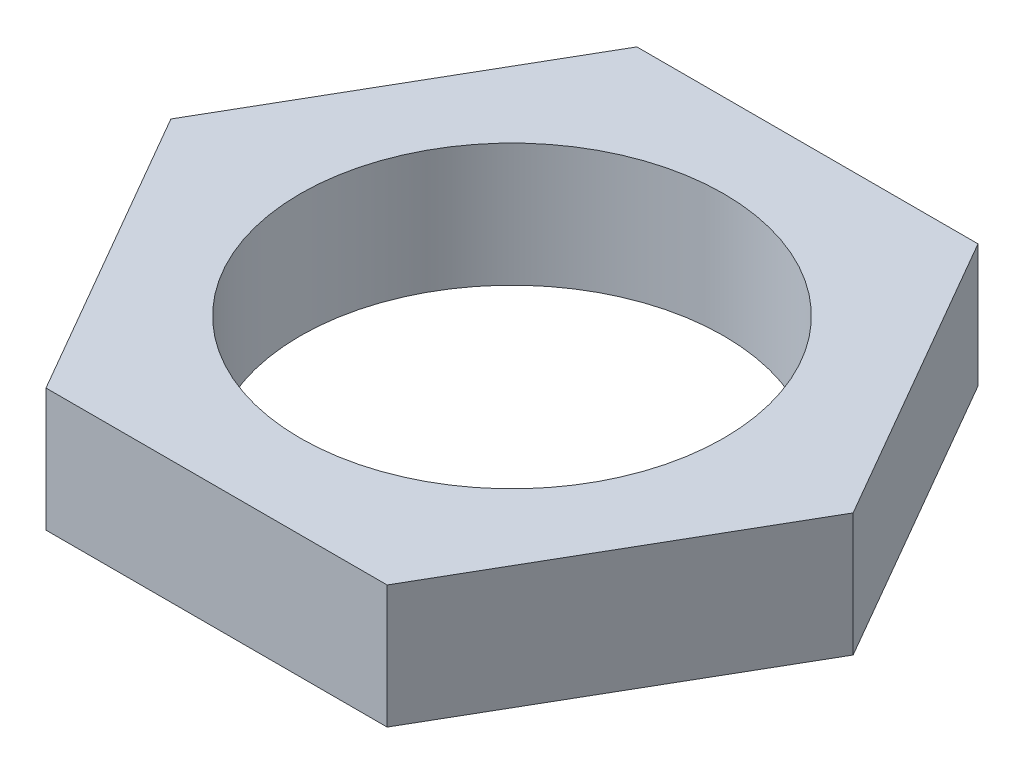
ISO-10303-21;
HEADER;
FILE_DESCRIPTION(('STEP AP214'),'2;1');
FILE_NAME('part.step','',(''),(''),'','','');
FILE_SCHEMA(('AUTOMOTIVE_DESIGN { 1 0 10303 214 1 1 1 1 }'));
ENDSEC;
DATA;
#1=APPLICATION_CONTEXT('core data for automotive mechanical design processes');
#2=APPLICATION_PROTOCOL_DEFINITION('international standard','automotive_design',2000,#1);
#3=PRODUCT_CONTEXT('',#1,'mechanical');
#4=PRODUCT('Part','Part','',(#3));
#5=PRODUCT_RELATED_PRODUCT_CATEGORY('part','',(#4));
#6=PRODUCT_DEFINITION_FORMATION('','',#4);
#7=PRODUCT_DEFINITION_CONTEXT('part definition',#1,'design');
#8=PRODUCT_DEFINITION('design','',#6,#7);
#9=PRODUCT_DEFINITION_SHAPE('','',#8);
#10=(LENGTH_UNIT() NAMED_UNIT(*) SI_UNIT(.MILLI.,.METRE.));
#11=(NAMED_UNIT(*) PLANE_ANGLE_UNIT() SI_UNIT($,.RADIAN.));
#12=(NAMED_UNIT(*) SI_UNIT($,.STERADIAN.) SOLID_ANGLE_UNIT());
#13=UNCERTAINTY_MEASURE_WITH_UNIT(LENGTH_MEASURE(1.E-05),#10,'distance_accuracy_value','');
#14=(GEOMETRIC_REPRESENTATION_CONTEXT(3) GLOBAL_UNCERTAINTY_ASSIGNED_CONTEXT((#13)) GLOBAL_UNIT_ASSIGNED_CONTEXT((#10,
#11,#12)) REPRESENTATION_CONTEXT('',''));
#15=CARTESIAN_POINT('',(0.,0.,0.));
#16=DIRECTION('',(0.,0.,1.));
#17=DIRECTION('',(1.,0.,0.));
#18=AXIS2_PLACEMENT_3D('',#15,#16,#17);
#19=CARTESIAN_POINT('',(6.92820323027551,5.,12.));
#20=DIRECTION('',(0.,1.,0.));
#21=DIRECTION('',(0.,0.,1.));
#22=AXIS2_PLACEMENT_3D('',#19,#20,#21);
#23=PLANE('',#22);
#24=DIRECTION('',(1.,0.,0.));
#25=VECTOR('',#24,1.);
#26=CARTESIAN_POINT('',(-6.92820323027551,5.,12.));
#27=LINE('',#26,#25);
#28=CARTESIAN_POINT('',(-6.92820323027551,5.,12.));
#29=VERTEX_POINT('',#28);
#30=CARTESIAN_POINT('',(6.92820323027551,5.,12.));
#31=VERTEX_POINT('',#30);
#32=EDGE_CURVE('E127',#29,#31,#27,.T.);
#33=ORIENTED_EDGE('',*,*,#32,.T.);
#34=DIRECTION('',(0.5,0.,-0.866025403784439));
#35=VECTOR('',#34,1.);
#36=CARTESIAN_POINT('',(6.92820323027551,5.,12.));
#37=LINE('',#36,#35);
#38=CARTESIAN_POINT('',(13.856406460551,5.,0.));
#39=VERTEX_POINT('',#38);
#40=EDGE_CURVE('E85',#31,#39,#37,.T.);
#41=ORIENTED_EDGE('',*,*,#40,.T.);
#42=DIRECTION('',(-0.5,0.,-0.866025403784439));
#43=VECTOR('',#42,1.);
#44=CARTESIAN_POINT('',(13.856406460551,5.,0.));
#45=LINE('',#44,#43);
#46=CARTESIAN_POINT('',(6.92820323027551,5.,-12.));
#47=VERTEX_POINT('',#46);
#48=EDGE_CURVE('E98',#39,#47,#45,.T.);
#49=ORIENTED_EDGE('',*,*,#48,.T.);
#50=DIRECTION('',(-1.,0.,0.));
#51=VECTOR('',#50,1.);
#52=CARTESIAN_POINT('',(6.92820323027551,5.,-12.));
#53=LINE('',#52,#51);
#54=CARTESIAN_POINT('',(-6.92820323027551,5.,-12.));
#55=VERTEX_POINT('',#54);
#56=EDGE_CURVE('E92',#47,#55,#53,.T.);
#57=ORIENTED_EDGE('',*,*,#56,.T.);
#58=DIRECTION('',(-0.5,0.,0.866025403784438));
#59=VECTOR('',#58,1.);
#60=CARTESIAN_POINT('',(-6.92820323027551,5.,-12.));
#61=LINE('',#60,#59);
#62=CARTESIAN_POINT('',(-13.856406460551,5.,0.));
#63=VERTEX_POINT('',#62);
#64=EDGE_CURVE('E96',#55,#63,#61,.T.);
#65=ORIENTED_EDGE('',*,*,#64,.T.);
#66=DIRECTION('',(0.5,0.,0.866025403784439));
#67=VECTOR('',#66,1.);
#68=CARTESIAN_POINT('',(-13.856406460551,5.,0.));
#69=LINE('',#68,#67);
#70=EDGE_CURVE('E48',#63,#29,#69,.T.);
#71=ORIENTED_EDGE('',*,*,#70,.T.);
#72=EDGE_LOOP('',(#33,#41,#49,#57,#65,#71));
#73=FACE_BOUND('',#72,.T.);
#74=CARTESIAN_POINT('',(0.,5.,0.));
#75=DIRECTION('',(0.,1.,0.));
#76=DIRECTION('',(0.,0.,1.));
#77=AXIS2_PLACEMENT_3D('',#74,#75,#76);
#78=CIRCLE('',#77,8.6);
#79=CARTESIAN_POINT('',(0.,5.,8.6));
#80=VERTEX_POINT('',#79);
#81=EDGE_CURVE('E120',#80,#80,#78,.T.);
#82=ORIENTED_EDGE('',*,*,#81,.F.);
#83=EDGE_LOOP('',(#82));
#84=FACE_BOUND('',#83,.T.);
#85=ADVANCED_FACE('F31',(#73,#84),#23,.T.);
#86=CARTESIAN_POINT('',(6.92820323027551,0.,12.));
#87=DIRECTION('',(0.,1.,0.));
#88=DIRECTION('',(0.,0.,1.));
#89=AXIS2_PLACEMENT_3D('',#86,#87,#88);
#90=PLANE('',#89);
#91=DIRECTION('',(1.,0.,0.));
#92=VECTOR('',#91,1.);
#93=CARTESIAN_POINT('',(-6.92820323027551,0.,12.));
#94=LINE('',#93,#92);
#95=CARTESIAN_POINT('',(-6.92820323027551,0.,12.));
#96=VERTEX_POINT('',#95);
#97=CARTESIAN_POINT('',(6.92820323027551,0.,12.));
#98=VERTEX_POINT('',#97);
#99=EDGE_CURVE('E116',#96,#98,#94,.T.);
#100=ORIENTED_EDGE('',*,*,#99,.F.);
#101=DIRECTION('',(0.5,0.,0.866025403784439));
#102=VECTOR('',#101,1.);
#103=CARTESIAN_POINT('',(-13.856406460551,0.,0.));
#104=LINE('',#103,#102);
#105=CARTESIAN_POINT('',(-13.856406460551,0.,0.));
#106=VERTEX_POINT('',#105);
#107=EDGE_CURVE('E77',#106,#96,#104,.T.);
#108=ORIENTED_EDGE('',*,*,#107,.F.);
#109=DIRECTION('',(-0.5,0.,0.866025403784438));
#110=VECTOR('',#109,1.);
#111=CARTESIAN_POINT('',(-6.92820323027551,0.,-12.));
#112=LINE('',#111,#110);
#113=CARTESIAN_POINT('',(-6.92820323027551,0.,-12.));
#114=VERTEX_POINT('',#113);
#115=EDGE_CURVE('E71',#114,#106,#112,.T.);
#116=ORIENTED_EDGE('',*,*,#115,.F.);
#117=DIRECTION('',(-1.,0.,0.));
#118=VECTOR('',#117,1.);
#119=CARTESIAN_POINT('',(6.92820323027551,0.,-12.));
#120=LINE('',#119,#118);
#121=CARTESIAN_POINT('',(6.92820323027551,0.,-12.));
#122=VERTEX_POINT('',#121);
#123=EDGE_CURVE('E106',#122,#114,#120,.T.);
#124=ORIENTED_EDGE('',*,*,#123,.F.);
#125=DIRECTION('',(-0.5,0.,-0.866025403784439));
#126=VECTOR('',#125,1.);
#127=CARTESIAN_POINT('',(13.856406460551,0.,0.));
#128=LINE('',#127,#126);
#129=CARTESIAN_POINT('',(13.856406460551,0.,0.));
#130=VERTEX_POINT('',#129);
#131=EDGE_CURVE('E122',#130,#122,#128,.T.);
#132=ORIENTED_EDGE('',*,*,#131,.F.);
#133=DIRECTION('',(0.5,0.,-0.866025403784439));
#134=VECTOR('',#133,1.);
#135=CARTESIAN_POINT('',(6.92820323027551,0.,12.));
#136=LINE('',#135,#134);
#137=EDGE_CURVE('E119',#98,#130,#136,.T.);
#138=ORIENTED_EDGE('',*,*,#137,.F.);
#139=EDGE_LOOP('',(#100,#108,#116,#124,#132,#138));
#140=FACE_BOUND('',#139,.T.);
#141=CARTESIAN_POINT('',(0.,0.,0.));
#142=DIRECTION('',(0.,1.,0.));
#143=DIRECTION('',(0.,0.,1.));
#144=AXIS2_PLACEMENT_3D('',#141,#142,#143);
#145=CIRCLE('',#144,8.6);
#146=CARTESIAN_POINT('',(0.,0.,8.6));
#147=VERTEX_POINT('',#146);
#148=EDGE_CURVE('E220',#147,#147,#145,.T.);
#149=ORIENTED_EDGE('',*,*,#148,.T.);
#150=EDGE_LOOP('',(#149));
#151=FACE_BOUND('',#150,.T.);
#152=ADVANCED_FACE('F136',(#140,#151),#90,.F.);
#153=CARTESIAN_POINT('',(-6.92820323027551,5.,12.));
#154=DIRECTION('',(0.,0.,-1.));
#155=DIRECTION('',(-1.,0.,0.));
#156=AXIS2_PLACEMENT_3D('',#153,#154,#155);
#157=PLANE('',#156);
#158=ORIENTED_EDGE('',*,*,#99,.T.);
#159=DIRECTION('',(0.,-1.,0.));
#160=VECTOR('',#159,1.);
#161=CARTESIAN_POINT('',(6.92820323027551,5.,12.));
#162=LINE('',#161,#160);
#163=EDGE_CURVE('E11',#31,#98,#162,.T.);
#164=ORIENTED_EDGE('',*,*,#163,.F.);
#165=ORIENTED_EDGE('',*,*,#32,.F.);
#166=DIRECTION('',(0.,-1.,0.));
#167=VECTOR('',#166,1.);
#168=CARTESIAN_POINT('',(-6.92820323027551,5.,12.));
#169=LINE('',#168,#167);
#170=EDGE_CURVE('E112',#29,#96,#169,.T.);
#171=ORIENTED_EDGE('',*,*,#170,.T.);
#172=EDGE_LOOP('',(#158,#164,#165,#171));
#173=FACE_BOUND('',#172,.T.);
#174=ADVANCED_FACE('F33',(#173),#157,.F.);
#175=CARTESIAN_POINT('',(6.92820323027551,5.,12.));
#176=DIRECTION('',(-0.866025403784439,0.,-0.5));
#177=DIRECTION('',(-0.5,0.,0.866025403784439));
#178=AXIS2_PLACEMENT_3D('',#175,#176,#177);
#179=PLANE('',#178);
#180=ORIENTED_EDGE('',*,*,#137,.T.);
#181=DIRECTION('',(0.,-1.,0.));
#182=VECTOR('',#181,1.);
#183=CARTESIAN_POINT('',(13.856406460551,5.,0.));
#184=LINE('',#183,#182);
#185=EDGE_CURVE('E40',#39,#130,#184,.T.);
#186=ORIENTED_EDGE('',*,*,#185,.F.);
#187=ORIENTED_EDGE('',*,*,#40,.F.);
#188=ORIENTED_EDGE('',*,*,#163,.T.);
#189=EDGE_LOOP('',(#180,#186,#187,#188));
#190=FACE_BOUND('',#189,.T.);
#191=ADVANCED_FACE('F161',(#190),#179,.F.);
#192=CARTESIAN_POINT('',(13.856406460551,5.,0.));
#193=DIRECTION('',(-0.866025403784439,0.,0.5));
#194=DIRECTION('',(0.5,0.,0.866025403784439));
#195=AXIS2_PLACEMENT_3D('',#192,#193,#194);
#196=PLANE('',#195);
#197=ORIENTED_EDGE('',*,*,#131,.T.);
#198=DIRECTION('',(0.,-1.,0.));
#199=VECTOR('',#198,1.);
#200=CARTESIAN_POINT('',(6.92820323027551,5.,-12.));
#201=LINE('',#200,#199);
#202=EDGE_CURVE('E107',#47,#122,#201,.T.);
#203=ORIENTED_EDGE('',*,*,#202,.F.);
#204=ORIENTED_EDGE('',*,*,#48,.F.);
#205=ORIENTED_EDGE('',*,*,#185,.T.);
#206=EDGE_LOOP('',(#197,#203,#204,#205));
#207=FACE_BOUND('',#206,.T.);
#208=ADVANCED_FACE('F133',(#207),#196,.F.);
#209=CARTESIAN_POINT('',(6.92820323027551,5.,-12.));
#210=DIRECTION('',(0.,0.,1.));
#211=DIRECTION('',(1.,0.,0.));
#212=AXIS2_PLACEMENT_3D('',#209,#210,#211);
#213=PLANE('',#212);
#214=ORIENTED_EDGE('',*,*,#123,.T.);
#215=DIRECTION('',(0.,-1.,0.));
#216=VECTOR('',#215,1.);
#217=CARTESIAN_POINT('',(-6.92820323027551,5.,-12.));
#218=LINE('',#217,#216);
#219=EDGE_CURVE('E103',#55,#114,#218,.T.);
#220=ORIENTED_EDGE('',*,*,#219,.F.);
#221=ORIENTED_EDGE('',*,*,#56,.F.);
#222=ORIENTED_EDGE('',*,*,#202,.T.);
#223=EDGE_LOOP('',(#214,#220,#221,#222));
#224=FACE_BOUND('',#223,.T.);
#225=ADVANCED_FACE('F104',(#224),#213,.F.);
#226=CARTESIAN_POINT('',(-6.92820323027551,5.,-12.));
#227=DIRECTION('',(0.866025403784438,0.,0.5));
#228=DIRECTION('',(0.5,0.,-0.866025403784439));
#229=AXIS2_PLACEMENT_3D('',#226,#227,#228);
#230=PLANE('',#229);
#231=ORIENTED_EDGE('',*,*,#115,.T.);
#232=DIRECTION('',(0.,-1.,0.));
#233=VECTOR('',#232,1.);
#234=CARTESIAN_POINT('',(-13.856406460551,5.,0.));
#235=LINE('',#234,#233);
#236=EDGE_CURVE('E108',#63,#106,#235,.T.);
#237=ORIENTED_EDGE('',*,*,#236,.F.);
#238=ORIENTED_EDGE('',*,*,#64,.F.);
#239=ORIENTED_EDGE('',*,*,#219,.T.);
#240=EDGE_LOOP('',(#231,#237,#238,#239));
#241=FACE_BOUND('',#240,.T.);
#242=ADVANCED_FACE('F110',(#241),#230,.F.);
#243=CARTESIAN_POINT('',(-13.856406460551,5.,0.));
#244=DIRECTION('',(0.866025403784439,0.,-0.5));
#245=DIRECTION('',(-0.5,0.,-0.866025403784439));
#246=AXIS2_PLACEMENT_3D('',#243,#244,#245);
#247=PLANE('',#246);
#248=ORIENTED_EDGE('',*,*,#107,.T.);
#249=ORIENTED_EDGE('',*,*,#170,.F.);
#250=ORIENTED_EDGE('',*,*,#70,.F.);
#251=ORIENTED_EDGE('',*,*,#236,.T.);
#252=EDGE_LOOP('',(#248,#249,#250,#251));
#253=FACE_BOUND('',#252,.T.);
#254=ADVANCED_FACE('F141',(#253),#247,.F.);
#255=CARTESIAN_POINT('',(0.,5.,0.));
#256=DIRECTION('',(0.,-1.,0.));
#257=DIRECTION('',(0.,0.,-1.));
#258=AXIS2_PLACEMENT_3D('',#255,#256,#257);
#259=CYLINDRICAL_SURFACE('',#258,8.6);
#260=ORIENTED_EDGE('',*,*,#81,.T.);
#261=EDGE_LOOP('',(#260));
#262=FACE_BOUND('',#261,.T.);
#263=ORIENTED_EDGE('',*,*,#148,.F.);
#264=EDGE_LOOP('',(#263));
#265=FACE_BOUND('',#264,.T.);
#266=ADVANCED_FACE('F143',(#262,#265),#259,.F.);
#267=CLOSED_SHELL('',(#85,#152,#174,#191,#208,#225,#242,#254,#266));
#268=MANIFOLD_SOLID_BREP('B2',#267);
#269=ADVANCED_BREP_SHAPE_REPRESENTATION('',(#18,#268),#14);
#270=SHAPE_DEFINITION_REPRESENTATION(#9,#269);
ENDSEC;
END-ISO-10303-21;
